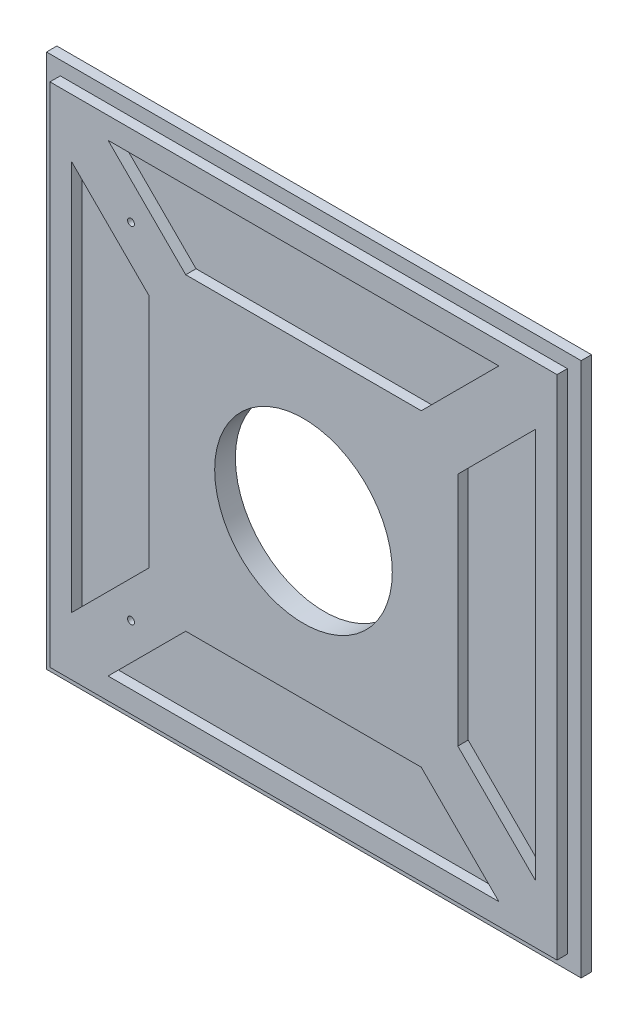
ISO-10303-21;
HEADER;
FILE_DESCRIPTION(('STEP AP214'),'2;1');
FILE_NAME('part.step','',(''),(''),'','','');
FILE_SCHEMA(('AUTOMOTIVE_DESIGN { 1 0 10303 214 1 1 1 1 }'));
ENDSEC;
DATA;
#1=APPLICATION_CONTEXT('core data for automotive mechanical design processes');
#2=APPLICATION_PROTOCOL_DEFINITION('international standard','automotive_design',2000,#1);
#3=PRODUCT_CONTEXT('',#1,'mechanical');
#4=PRODUCT('Part','Part','',(#3));
#5=PRODUCT_RELATED_PRODUCT_CATEGORY('part','',(#4));
#6=PRODUCT_DEFINITION_FORMATION('','',#4);
#7=PRODUCT_DEFINITION_CONTEXT('part definition',#1,'design');
#8=PRODUCT_DEFINITION('design','',#6,#7);
#9=PRODUCT_DEFINITION_SHAPE('','',#8);
#10=(LENGTH_UNIT() NAMED_UNIT(*) SI_UNIT(.MILLI.,.METRE.));
#11=(NAMED_UNIT(*) PLANE_ANGLE_UNIT() SI_UNIT($,.RADIAN.));
#12=(NAMED_UNIT(*) SI_UNIT($,.STERADIAN.) SOLID_ANGLE_UNIT());
#13=UNCERTAINTY_MEASURE_WITH_UNIT(LENGTH_MEASURE(1.E-05),#10,'distance_accuracy_value','');
#14=(GEOMETRIC_REPRESENTATION_CONTEXT(3) GLOBAL_UNCERTAINTY_ASSIGNED_CONTEXT((#13)) GLOBAL_UNIT_ASSIGNED_CONTEXT((#10,
#11,#12)) REPRESENTATION_CONTEXT('',''));
#15=CARTESIAN_POINT('',(0.,0.,0.));
#16=DIRECTION('',(0.,0.,1.));
#17=DIRECTION('',(1.,0.,0.));
#18=AXIS2_PLACEMENT_3D('',#15,#16,#17);
#19=CARTESIAN_POINT('',(0.,0.,0.));
#20=DIRECTION('',(0.,0.,1.));
#21=DIRECTION('',(1.,0.,0.));
#22=AXIS2_PLACEMENT_3D('',#19,#20,#21);
#23=PLANE('',#22);
#24=DIRECTION('',(0.,1.,0.));
#25=VECTOR('',#24,1.);
#26=CARTESIAN_POINT('',(260.,-99.,0.));
#27=LINE('',#26,#25);
#28=CARTESIAN_POINT('',(260.,-109.,0.));
#29=VERTEX_POINT('',#28);
#30=CARTESIAN_POINT('',(260.,-99.,0.));
#31=VERTEX_POINT('',#30);
#32=EDGE_CURVE('E315',#29,#31,#27,.T.);
#33=ORIENTED_EDGE('',*,*,#32,.F.);
#34=DIRECTION('',(-1.,0.,0.));
#35=VECTOR('',#34,1.);
#36=CARTESIAN_POINT('',(260.,-109.,0.));
#37=LINE('',#36,#35);
#38=CARTESIAN_POINT('',(285.,-109.,0.));
#39=VERTEX_POINT('',#38);
#40=EDGE_CURVE('E324',#39,#29,#37,.T.);
#41=ORIENTED_EDGE('',*,*,#40,.F.);
#42=DIRECTION('',(0.,-1.,0.));
#43=VECTOR('',#42,1.);
#44=CARTESIAN_POINT('',(285.,-99.,0.));
#45=LINE('',#44,#43);
#46=CARTESIAN_POINT('',(285.,-99.,0.));
#47=VERTEX_POINT('',#46);
#48=EDGE_CURVE('E332',#47,#39,#45,.T.);
#49=ORIENTED_EDGE('',*,*,#48,.F.);
#50=DIRECTION('',(1.,0.,0.));
#51=VECTOR('',#50,1.);
#52=CARTESIAN_POINT('',(260.,-99.,0.));
#53=LINE('',#52,#51);
#54=EDGE_CURVE('E328',#31,#47,#53,.T.);
#55=ORIENTED_EDGE('',*,*,#54,.F.);
#56=EDGE_LOOP('',(#33,#41,#49,#55));
#57=FACE_BOUND('',#56,.T.);
#58=CARTESIAN_POINT('',(55.,-55.,0.));
#59=DIRECTION('',(0.,0.,-1.));
#60=DIRECTION('',(-1.,0.,0.));
#61=AXIS2_PLACEMENT_3D('',#58,#59,#60);
#62=CIRCLE('',#61,2.);
#63=CARTESIAN_POINT('',(53.,-55.,0.));
#64=VERTEX_POINT('',#63);
#65=EDGE_CURVE('E358',#64,#64,#62,.T.);
#66=ORIENTED_EDGE('',*,*,#65,.F.);
#67=EDGE_LOOP('',(#66));
#68=FACE_BOUND('',#67,.T.);
#69=CARTESIAN_POINT('',(55.,-255.,0.));
#70=DIRECTION('',(0.,0.,-1.));
#71=DIRECTION('',(-1.,0.,0.));
#72=AXIS2_PLACEMENT_3D('',#69,#70,#71);
#73=CIRCLE('',#72,2.);
#74=CARTESIAN_POINT('',(53.,-255.,0.));
#75=VERTEX_POINT('',#74);
#76=EDGE_CURVE('E362',#75,#75,#73,.T.);
#77=ORIENTED_EDGE('',*,*,#76,.F.);
#78=EDGE_LOOP('',(#77));
#79=FACE_BOUND('',#78,.T.);
#80=CARTESIAN_POINT('',(155.,-155.,0.));
#81=DIRECTION('',(0.,0.,1.));
#82=DIRECTION('',(1.,0.,0.));
#83=AXIS2_PLACEMENT_3D('',#80,#81,#82);
#84=CIRCLE('',#83,51.5);
#85=CARTESIAN_POINT('',(206.5,-155.,0.));
#86=VERTEX_POINT('',#85);
#87=EDGE_CURVE('E369',#86,#86,#84,.T.);
#88=ORIENTED_EDGE('',*,*,#87,.T.);
#89=EDGE_LOOP('',(#88));
#90=FACE_BOUND('',#89,.T.);
#91=DIRECTION('',(0.,-1.,0.));
#92=VECTOR('',#91,1.);
#93=CARTESIAN_POINT('',(0.,0.,0.));
#94=LINE('',#93,#92);
#95=CARTESIAN_POINT('',(0.,0.,0.));
#96=VERTEX_POINT('',#95);
#97=CARTESIAN_POINT('',(0.,-310.,0.));
#98=VERTEX_POINT('',#97);
#99=EDGE_CURVE('E597',#96,#98,#94,.T.);
#100=ORIENTED_EDGE('',*,*,#99,.F.);
#101=DIRECTION('',(-1.,0.,0.));
#102=VECTOR('',#101,1.);
#103=CARTESIAN_POINT('',(0.,0.,0.));
#104=LINE('',#103,#102);
#105=CARTESIAN_POINT('',(310.,0.,0.));
#106=VERTEX_POINT('',#105);
#107=EDGE_CURVE('E603',#106,#96,#104,.T.);
#108=ORIENTED_EDGE('',*,*,#107,.F.);
#109=DIRECTION('',(0.,1.,0.));
#110=VECTOR('',#109,1.);
#111=CARTESIAN_POINT('',(310.,0.,0.));
#112=LINE('',#111,#110);
#113=CARTESIAN_POINT('',(310.,-310.,0.));
#114=VERTEX_POINT('',#113);
#115=EDGE_CURVE('E619',#114,#106,#112,.T.);
#116=ORIENTED_EDGE('',*,*,#115,.F.);
#117=DIRECTION('',(1.,0.,0.));
#118=VECTOR('',#117,1.);
#119=CARTESIAN_POINT('',(0.,-310.,0.));
#120=LINE('',#119,#118);
#121=EDGE_CURVE('E616',#98,#114,#120,.T.);
#122=ORIENTED_EDGE('',*,*,#121,.F.);
#123=EDGE_LOOP('',(#100,#108,#116,#122));
#124=FACE_BOUND('',#123,.T.);
#125=DIRECTION('',(0.,1.,0.));
#126=VECTOR('',#125,1.);
#127=CARTESIAN_POINT('',(260.,-211.,0.));
#128=LINE('',#127,#126);
#129=CARTESIAN_POINT('',(260.,-211.,0.));
#130=VERTEX_POINT('',#129);
#131=CARTESIAN_POINT('',(260.,-201.,0.));
#132=VERTEX_POINT('',#131);
#133=EDGE_CURVE('E311',#130,#132,#128,.T.);
#134=ORIENTED_EDGE('',*,*,#133,.F.);
#135=DIRECTION('',(-1.,0.,0.));
#136=VECTOR('',#135,1.);
#137=CARTESIAN_POINT('',(260.,-211.,0.));
#138=LINE('',#137,#136);
#139=CARTESIAN_POINT('',(285.,-211.,0.));
#140=VERTEX_POINT('',#139);
#141=EDGE_CURVE('E304',#140,#130,#138,.T.);
#142=ORIENTED_EDGE('',*,*,#141,.F.);
#143=DIRECTION('',(0.,-1.,0.));
#144=VECTOR('',#143,1.);
#145=CARTESIAN_POINT('',(285.,-211.,0.));
#146=LINE('',#145,#144);
#147=CARTESIAN_POINT('',(285.,-201.,0.));
#148=VERTEX_POINT('',#147);
#149=EDGE_CURVE('E66',#148,#140,#146,.T.);
#150=ORIENTED_EDGE('',*,*,#149,.F.);
#151=DIRECTION('',(1.,0.,0.));
#152=VECTOR('',#151,1.);
#153=CARTESIAN_POINT('',(260.,-201.,0.));
#154=LINE('',#153,#152);
#155=EDGE_CURVE('E61',#132,#148,#154,.T.);
#156=ORIENTED_EDGE('',*,*,#155,.F.);
#157=EDGE_LOOP('',(#134,#142,#150,#156));
#158=FACE_BOUND('',#157,.T.);
#159=ADVANCED_FACE('F45',(#57,#68,#79,#90,#124,#158),#23,.F.);
#160=CARTESIAN_POINT('',(0.,0.,6.));
#161=DIRECTION('',(1.,0.,0.));
#162=DIRECTION('',(0.,1.,0.));
#163=AXIS2_PLACEMENT_3D('',#160,#161,#162);
#164=PLANE('',#163);
#165=ORIENTED_EDGE('',*,*,#99,.T.);
#166=DIRECTION('',(0.,0.,-1.));
#167=VECTOR('',#166,1.);
#168=CARTESIAN_POINT('',(0.,-310.,6.));
#169=LINE('',#168,#167);
#170=CARTESIAN_POINT('',(0.,-310.,6.));
#171=VERTEX_POINT('',#170);
#172=EDGE_CURVE('E11',#171,#98,#169,.T.);
#173=ORIENTED_EDGE('',*,*,#172,.F.);
#174=DIRECTION('',(0.,-1.,0.));
#175=VECTOR('',#174,1.);
#176=CARTESIAN_POINT('',(0.,0.,6.));
#177=LINE('',#176,#175);
#178=CARTESIAN_POINT('',(0.,0.,6.));
#179=VERTEX_POINT('',#178);
#180=EDGE_CURVE('E598',#179,#171,#177,.T.);
#181=ORIENTED_EDGE('',*,*,#180,.F.);
#182=DIRECTION('',(0.,0.,-1.));
#183=VECTOR('',#182,1.);
#184=CARTESIAN_POINT('',(0.,0.,6.));
#185=LINE('',#184,#183);
#186=EDGE_CURVE('E612',#179,#96,#185,.T.);
#187=ORIENTED_EDGE('',*,*,#186,.T.);
#188=EDGE_LOOP('',(#165,#173,#181,#187));
#189=FACE_BOUND('',#188,.T.);
#190=ADVANCED_FACE('F47',(#189),#164,.F.);
#191=CARTESIAN_POINT('',(0.,-310.,6.));
#192=DIRECTION('',(0.,1.,0.));
#193=DIRECTION('',(0.,0.,1.));
#194=AXIS2_PLACEMENT_3D('',#191,#192,#193);
#195=PLANE('',#194);
#196=ORIENTED_EDGE('',*,*,#121,.T.);
#197=DIRECTION('',(0.,0.,-1.));
#198=VECTOR('',#197,1.);
#199=CARTESIAN_POINT('',(310.,-310.,6.));
#200=LINE('',#199,#198);
#201=CARTESIAN_POINT('',(310.,-310.,6.));
#202=VERTEX_POINT('',#201);
#203=EDGE_CURVE('E54',#202,#114,#200,.T.);
#204=ORIENTED_EDGE('',*,*,#203,.F.);
#205=DIRECTION('',(1.,0.,0.));
#206=VECTOR('',#205,1.);
#207=CARTESIAN_POINT('',(0.,-310.,6.));
#208=LINE('',#207,#206);
#209=EDGE_CURVE('E602',#171,#202,#208,.T.);
#210=ORIENTED_EDGE('',*,*,#209,.F.);
#211=ORIENTED_EDGE('',*,*,#172,.T.);
#212=EDGE_LOOP('',(#196,#204,#210,#211));
#213=FACE_BOUND('',#212,.T.);
#214=ADVANCED_FACE('F651',(#213),#195,.F.);
#215=CARTESIAN_POINT('',(310.,0.,6.));
#216=DIRECTION('',(-1.,0.,0.));
#217=DIRECTION('',(0.,-1.,0.));
#218=AXIS2_PLACEMENT_3D('',#215,#216,#217);
#219=PLANE('',#218);
#220=ORIENTED_EDGE('',*,*,#115,.T.);
#221=DIRECTION('',(0.,0.,-1.));
#222=VECTOR('',#221,1.);
#223=CARTESIAN_POINT('',(310.,0.,6.));
#224=LINE('',#223,#222);
#225=CARTESIAN_POINT('',(310.,0.,6.));
#226=VERTEX_POINT('',#225);
#227=EDGE_CURVE('E627',#226,#106,#224,.T.);
#228=ORIENTED_EDGE('',*,*,#227,.F.);
#229=DIRECTION('',(0.,1.,0.));
#230=VECTOR('',#229,1.);
#231=CARTESIAN_POINT('',(310.,0.,6.));
#232=LINE('',#231,#230);
#233=EDGE_CURVE('E606',#202,#226,#232,.T.);
#234=ORIENTED_EDGE('',*,*,#233,.F.);
#235=ORIENTED_EDGE('',*,*,#203,.T.);
#236=EDGE_LOOP('',(#220,#228,#234,#235));
#237=FACE_BOUND('',#236,.T.);
#238=ADVANCED_FACE('F636',(#237),#219,.F.);
#239=CARTESIAN_POINT('',(0.,0.,6.));
#240=DIRECTION('',(0.,-1.,0.));
#241=DIRECTION('',(0.,0.,-1.));
#242=AXIS2_PLACEMENT_3D('',#239,#240,#241);
#243=PLANE('',#242);
#244=ORIENTED_EDGE('',*,*,#107,.T.);
#245=ORIENTED_EDGE('',*,*,#186,.F.);
#246=DIRECTION('',(-1.,0.,0.));
#247=VECTOR('',#246,1.);
#248=CARTESIAN_POINT('',(0.,0.,6.));
#249=LINE('',#248,#247);
#250=EDGE_CURVE('E609',#226,#179,#249,.T.);
#251=ORIENTED_EDGE('',*,*,#250,.F.);
#252=ORIENTED_EDGE('',*,*,#227,.T.);
#253=EDGE_LOOP('',(#244,#245,#251,#252));
#254=FACE_BOUND('',#253,.T.);
#255=ADVANCED_FACE('F644',(#254),#243,.F.);
#256=CARTESIAN_POINT('',(0.,0.,6.));
#257=DIRECTION('',(0.,0.,1.));
#258=DIRECTION('',(1.,0.,0.));
#259=AXIS2_PLACEMENT_3D('',#256,#257,#258);
#260=PLANE('',#259);
#261=DIRECTION('',(0.,-1.,0.));
#262=VECTOR('',#261,1.);
#263=CARTESIAN_POINT('',(8.,-302.,6.));
#264=LINE('',#263,#262);
#265=CARTESIAN_POINT('',(8.,-8.,6.));
#266=VERTEX_POINT('',#265);
#267=CARTESIAN_POINT('',(8.,-302.,6.));
#268=VERTEX_POINT('',#267);
#269=EDGE_CURVE('E552',#266,#268,#264,.T.);
#270=ORIENTED_EDGE('',*,*,#269,.F.);
#271=DIRECTION('',(-1.,0.,0.));
#272=VECTOR('',#271,1.);
#273=CARTESIAN_POINT('',(33.,-8.,6.));
#274=LINE('',#273,#272);
#275=CARTESIAN_POINT('',(302.,-8.,6.));
#276=VERTEX_POINT('',#275);
#277=EDGE_CURVE('E558',#276,#266,#274,.T.);
#278=ORIENTED_EDGE('',*,*,#277,.F.);
#279=DIRECTION('',(0.,1.,0.));
#280=VECTOR('',#279,1.);
#281=CARTESIAN_POINT('',(302.,-8.,6.));
#282=LINE('',#281,#280);
#283=CARTESIAN_POINT('',(302.,-302.,6.));
#284=VERTEX_POINT('',#283);
#285=EDGE_CURVE('E575',#284,#276,#282,.T.);
#286=ORIENTED_EDGE('',*,*,#285,.F.);
#287=DIRECTION('',(1.,0.,0.));
#288=VECTOR('',#287,1.);
#289=CARTESIAN_POINT('',(302.,-302.,6.));
#290=LINE('',#289,#288);
#291=EDGE_CURVE('E571',#268,#284,#290,.T.);
#292=ORIENTED_EDGE('',*,*,#291,.F.);
#293=EDGE_LOOP('',(#270,#278,#286,#292));
#294=FACE_BOUND('',#293,.T.);
#295=ORIENTED_EDGE('',*,*,#180,.T.);
#296=ORIENTED_EDGE('',*,*,#209,.T.);
#297=ORIENTED_EDGE('',*,*,#233,.T.);
#298=ORIENTED_EDGE('',*,*,#250,.T.);
#299=EDGE_LOOP('',(#295,#296,#297,#298));
#300=FACE_BOUND('',#299,.T.);
#301=ADVANCED_FACE('F650',(#294,#300),#260,.T.);
#302=CARTESIAN_POINT('',(0.,0.,12.));
#303=DIRECTION('',(0.,0.,-1.));
#304=DIRECTION('',(-1.,0.,0.));
#305=AXIS2_PLACEMENT_3D('',#302,#303,#304);
#306=PLANE('',#305);
#307=CARTESIAN_POINT('',(55.,-55.,12.));
#308=DIRECTION('',(0.,0.,-1.));
#309=DIRECTION('',(-1.,0.,0.));
#310=AXIS2_PLACEMENT_3D('',#307,#308,#309);
#311=CIRCLE('',#310,2.);
#312=CARTESIAN_POINT('',(53.,-55.,12.));
#313=VERTEX_POINT('',#312);
#314=EDGE_CURVE('E353',#313,#313,#311,.T.);
#315=ORIENTED_EDGE('',*,*,#314,.T.);
#316=EDGE_LOOP('',(#315));
#317=FACE_BOUND('',#316,.T.);
#318=CARTESIAN_POINT('',(55.,-255.,12.));
#319=DIRECTION('',(0.,0.,-1.));
#320=DIRECTION('',(-1.,0.,0.));
#321=AXIS2_PLACEMENT_3D('',#318,#319,#320);
#322=CIRCLE('',#321,2.);
#323=CARTESIAN_POINT('',(53.,-255.,12.));
#324=VERTEX_POINT('',#323);
#325=EDGE_CURVE('E352',#324,#324,#322,.T.);
#326=ORIENTED_EDGE('',*,*,#325,.T.);
#327=EDGE_LOOP('',(#326));
#328=FACE_BOUND('',#327,.T.);
#329=CARTESIAN_POINT('',(155.,-155.,12.));
#330=DIRECTION('',(0.,0.,1.));
#331=DIRECTION('',(1.,0.,0.));
#332=AXIS2_PLACEMENT_3D('',#329,#330,#331);
#333=CIRCLE('',#332,51.5);
#334=CARTESIAN_POINT('',(206.5,-155.,12.));
#335=VERTEX_POINT('',#334);
#336=EDGE_CURVE('E357',#335,#335,#333,.T.);
#337=ORIENTED_EDGE('',*,*,#336,.F.);
#338=EDGE_LOOP('',(#337));
#339=FACE_BOUND('',#338,.T.);
#340=DIRECTION('',(0.,1.,0.));
#341=VECTOR('',#340,1.);
#342=CARTESIAN_POINT('',(289.5,-41.7132034355964,12.));
#343=LINE('',#342,#341);
#344=CARTESIAN_POINT('',(289.5,-268.286796564404,12.));
#345=VERTEX_POINT('',#344);
#346=CARTESIAN_POINT('',(289.5,-41.7132034355964,12.));
#347=VERTEX_POINT('',#346);
#348=EDGE_CURVE('E421',#345,#347,#343,.T.);
#349=ORIENTED_EDGE('',*,*,#348,.F.);
#350=DIRECTION('',(0.707106781186547,-0.707106781186547,0.));
#351=VECTOR('',#350,1.);
#352=CARTESIAN_POINT('',(244.5,-223.286796564404,12.));
#353=LINE('',#352,#351);
#354=CARTESIAN_POINT('',(244.5,-223.286796564404,12.));
#355=VERTEX_POINT('',#354);
#356=EDGE_CURVE('E432',#355,#345,#353,.T.);
#357=ORIENTED_EDGE('',*,*,#356,.F.);
#358=DIRECTION('',(0.,-1.,0.));
#359=VECTOR('',#358,1.);
#360=CARTESIAN_POINT('',(244.5,-86.7132034355965,12.));
#361=LINE('',#360,#359);
#362=CARTESIAN_POINT('',(244.5,-86.7132034355965,12.));
#363=VERTEX_POINT('',#362);
#364=EDGE_CURVE('E428',#363,#355,#361,.T.);
#365=ORIENTED_EDGE('',*,*,#364,.F.);
#366=DIRECTION('',(-0.707106781186547,-0.707106781186548,0.));
#367=VECTOR('',#366,1.);
#368=CARTESIAN_POINT('',(289.5,-41.7132034355964,12.));
#369=LINE('',#368,#367);
#370=EDGE_CURVE('E424',#347,#363,#369,.T.);
#371=ORIENTED_EDGE('',*,*,#370,.F.);
#372=EDGE_LOOP('',(#349,#357,#365,#371));
#373=FACE_BOUND('',#372,.T.);
#374=DIRECTION('',(-1.,0.,0.));
#375=VECTOR('',#374,1.);
#376=CARTESIAN_POINT('',(268.286796564404,-20.5,12.));
#377=LINE('',#376,#375);
#378=CARTESIAN_POINT('',(268.286796564404,-20.5,12.));
#379=VERTEX_POINT('',#378);
#380=CARTESIAN_POINT('',(41.7132034355965,-20.5,12.));
#381=VERTEX_POINT('',#380);
#382=EDGE_CURVE('E509',#379,#381,#377,.T.);
#383=ORIENTED_EDGE('',*,*,#382,.F.);
#384=DIRECTION('',(0.707106781186547,0.707106781186548,0.));
#385=VECTOR('',#384,1.);
#386=CARTESIAN_POINT('',(268.286796564404,-20.5,12.));
#387=LINE('',#386,#385);
#388=CARTESIAN_POINT('',(223.286796564404,-65.5,12.));
#389=VERTEX_POINT('',#388);
#390=EDGE_CURVE('E520',#389,#379,#387,.T.);
#391=ORIENTED_EDGE('',*,*,#390,.F.);
#392=DIRECTION('',(1.,0.,0.));
#393=VECTOR('',#392,1.);
#394=CARTESIAN_POINT('',(86.7132034355965,-65.5,12.));
#395=LINE('',#394,#393);
#396=CARTESIAN_POINT('',(86.7132034355965,-65.5,12.));
#397=VERTEX_POINT('',#396);
#398=EDGE_CURVE('E516',#397,#389,#395,.T.);
#399=ORIENTED_EDGE('',*,*,#398,.F.);
#400=DIRECTION('',(0.707106781186548,-0.707106781186547,0.));
#401=VECTOR('',#400,1.);
#402=CARTESIAN_POINT('',(86.7132034355965,-65.5,12.));
#403=LINE('',#402,#401);
#404=EDGE_CURVE('E512',#381,#397,#403,.T.);
#405=ORIENTED_EDGE('',*,*,#404,.F.);
#406=EDGE_LOOP('',(#383,#391,#399,#405));
#407=FACE_BOUND('',#406,.T.);
#408=DIRECTION('',(-1.,0.,0.));
#409=VECTOR('',#408,1.);
#410=CARTESIAN_POINT('',(8.,-8.,12.));
#411=LINE('',#410,#409);
#412=CARTESIAN_POINT('',(302.,-8.,12.));
#413=VERTEX_POINT('',#412);
#414=CARTESIAN_POINT('',(8.,-8.,12.));
#415=VERTEX_POINT('',#414);
#416=EDGE_CURVE('E553',#413,#415,#411,.T.);
#417=ORIENTED_EDGE('',*,*,#416,.T.);
#418=DIRECTION('',(0.,-1.,0.));
#419=VECTOR('',#418,1.);
#420=CARTESIAN_POINT('',(8.,-8.,12.));
#421=LINE('',#420,#419);
#422=CARTESIAN_POINT('',(8.,-302.,12.));
#423=VERTEX_POINT('',#422);
#424=EDGE_CURVE('E557',#415,#423,#421,.T.);
#425=ORIENTED_EDGE('',*,*,#424,.T.);
#426=DIRECTION('',(1.,0.,0.));
#427=VECTOR('',#426,1.);
#428=CARTESIAN_POINT('',(8.,-302.,12.));
#429=LINE('',#428,#427);
#430=CARTESIAN_POINT('',(302.,-302.,12.));
#431=VERTEX_POINT('',#430);
#432=EDGE_CURVE('E561',#423,#431,#429,.T.);
#433=ORIENTED_EDGE('',*,*,#432,.T.);
#434=DIRECTION('',(0.,1.,0.));
#435=VECTOR('',#434,1.);
#436=CARTESIAN_POINT('',(302.,-302.,12.));
#437=LINE('',#436,#435);
#438=EDGE_CURVE('E564',#431,#413,#437,.T.);
#439=ORIENTED_EDGE('',*,*,#438,.T.);
#440=EDGE_LOOP('',(#417,#425,#433,#439));
#441=FACE_BOUND('',#440,.T.);
#442=DIRECTION('',(0.,-1.,0.));
#443=VECTOR('',#442,1.);
#444=CARTESIAN_POINT('',(20.5,-41.7132034355964,12.));
#445=LINE('',#444,#443);
#446=CARTESIAN_POINT('',(20.5,-41.7132034355964,12.));
#447=VERTEX_POINT('',#446);
#448=CARTESIAN_POINT('',(20.5,-268.286796564404,12.));
#449=VERTEX_POINT('',#448);
#450=EDGE_CURVE('E465',#447,#449,#445,.T.);
#451=ORIENTED_EDGE('',*,*,#450,.F.);
#452=DIRECTION('',(-0.707106781186548,0.707106781186548,0.));
#453=VECTOR('',#452,1.);
#454=CARTESIAN_POINT('',(20.5,-41.7132034355964,12.));
#455=LINE('',#454,#453);
#456=CARTESIAN_POINT('',(65.5,-86.7132034355964,12.));
#457=VERTEX_POINT('',#456);
#458=EDGE_CURVE('E476',#457,#447,#455,.T.);
#459=ORIENTED_EDGE('',*,*,#458,.F.);
#460=DIRECTION('',(0.,1.,0.));
#461=VECTOR('',#460,1.);
#462=CARTESIAN_POINT('',(65.5,-86.7132034355964,12.));
#463=LINE('',#462,#461);
#464=CARTESIAN_POINT('',(65.5,-223.286796564404,12.));
#465=VERTEX_POINT('',#464);
#466=EDGE_CURVE('E472',#465,#457,#463,.T.);
#467=ORIENTED_EDGE('',*,*,#466,.F.);
#468=DIRECTION('',(0.707106781186547,0.707106781186547,0.));
#469=VECTOR('',#468,1.);
#470=CARTESIAN_POINT('',(65.5,-223.286796564404,12.));
#471=LINE('',#470,#469);
#472=EDGE_CURVE('E468',#449,#465,#471,.T.);
#473=ORIENTED_EDGE('',*,*,#472,.F.);
#474=EDGE_LOOP('',(#451,#459,#467,#473));
#475=FACE_BOUND('',#474,.T.);
#476=DIRECTION('',(-0.707106781186548,0.707106781186547,0.));
#477=VECTOR('',#476,1.);
#478=CARTESIAN_POINT('',(223.286796564404,-244.5,12.));
#479=LINE('',#478,#477);
#480=CARTESIAN_POINT('',(268.286796564404,-289.5,12.));
#481=VERTEX_POINT('',#480);
#482=CARTESIAN_POINT('',(223.286796564404,-244.5,12.));
#483=VERTEX_POINT('',#482);
#484=EDGE_CURVE('E377',#481,#483,#479,.T.);
#485=ORIENTED_EDGE('',*,*,#484,.F.);
#486=DIRECTION('',(1.,0.,0.));
#487=VECTOR('',#486,1.);
#488=CARTESIAN_POINT('',(268.286796564404,-289.5,12.));
#489=LINE('',#488,#487);
#490=CARTESIAN_POINT('',(41.7132034355964,-289.5,12.));
#491=VERTEX_POINT('',#490);
#492=EDGE_CURVE('E388',#491,#481,#489,.T.);
#493=ORIENTED_EDGE('',*,*,#492,.F.);
#494=DIRECTION('',(-0.707106781186548,-0.707106781186547,0.));
#495=VECTOR('',#494,1.);
#496=CARTESIAN_POINT('',(41.7132034355964,-289.5,12.));
#497=LINE('',#496,#495);
#498=CARTESIAN_POINT('',(86.7132034355964,-244.5,12.));
#499=VERTEX_POINT('',#498);
#500=EDGE_CURVE('E384',#499,#491,#497,.T.);
#501=ORIENTED_EDGE('',*,*,#500,.F.);
#502=DIRECTION('',(-1.,0.,0.));
#503=VECTOR('',#502,1.);
#504=CARTESIAN_POINT('',(86.7132034355964,-244.5,12.));
#505=LINE('',#504,#503);
#506=EDGE_CURVE('E380',#483,#499,#505,.T.);
#507=ORIENTED_EDGE('',*,*,#506,.F.);
#508=EDGE_LOOP('',(#485,#493,#501,#507));
#509=FACE_BOUND('',#508,.T.);
#510=ADVANCED_FACE('F673',(#317,#328,#339,#373,#407,#441,#475,#509),#306,.F.);
#511=CARTESIAN_POINT('',(8.,-302.,12.));
#512=DIRECTION('',(1.,0.,0.));
#513=DIRECTION('',(0.,1.,0.));
#514=AXIS2_PLACEMENT_3D('',#511,#512,#513);
#515=PLANE('',#514);
#516=ORIENTED_EDGE('',*,*,#269,.T.);
#517=DIRECTION('',(0.,0.,-1.));
#518=VECTOR('',#517,1.);
#519=CARTESIAN_POINT('',(8.,-302.,12.));
#520=LINE('',#519,#518);
#521=EDGE_CURVE('E589',#423,#268,#520,.T.);
#522=ORIENTED_EDGE('',*,*,#521,.F.);
#523=ORIENTED_EDGE('',*,*,#424,.F.);
#524=DIRECTION('',(0.,0.,-1.));
#525=VECTOR('',#524,1.);
#526=CARTESIAN_POINT('',(8.,-8.,12.));
#527=LINE('',#526,#525);
#528=EDGE_CURVE('E593',#415,#266,#527,.T.);
#529=ORIENTED_EDGE('',*,*,#528,.T.);
#530=EDGE_LOOP('',(#516,#522,#523,#529));
#531=FACE_BOUND('',#530,.T.);
#532=ADVANCED_FACE('F681',(#531),#515,.F.);
#533=CARTESIAN_POINT('',(302.,-302.,12.));
#534=DIRECTION('',(0.,1.,0.));
#535=DIRECTION('',(0.,0.,1.));
#536=AXIS2_PLACEMENT_3D('',#533,#534,#535);
#537=PLANE('',#536);
#538=ORIENTED_EDGE('',*,*,#291,.T.);
#539=DIRECTION('',(0.,0.,-1.));
#540=VECTOR('',#539,1.);
#541=CARTESIAN_POINT('',(302.,-302.,12.));
#542=LINE('',#541,#540);
#543=EDGE_CURVE('E585',#431,#284,#542,.T.);
#544=ORIENTED_EDGE('',*,*,#543,.F.);
#545=ORIENTED_EDGE('',*,*,#432,.F.);
#546=ORIENTED_EDGE('',*,*,#521,.T.);
#547=EDGE_LOOP('',(#538,#544,#545,#546));
#548=FACE_BOUND('',#547,.T.);
#549=ADVANCED_FACE('F775',(#548),#537,.F.);
#550=CARTESIAN_POINT('',(302.,-8.,12.));
#551=DIRECTION('',(-1.,0.,0.));
#552=DIRECTION('',(0.,0.,1.));
#553=AXIS2_PLACEMENT_3D('',#550,#551,#552);
#554=PLANE('',#553);
#555=ORIENTED_EDGE('',*,*,#285,.T.);
#556=DIRECTION('',(0.,0.,-1.));
#557=VECTOR('',#556,1.);
#558=CARTESIAN_POINT('',(302.,-8.,12.));
#559=LINE('',#558,#557);
#560=EDGE_CURVE('E567',#413,#276,#559,.T.);
#561=ORIENTED_EDGE('',*,*,#560,.F.);
#562=ORIENTED_EDGE('',*,*,#438,.F.);
#563=ORIENTED_EDGE('',*,*,#543,.T.);
#564=EDGE_LOOP('',(#555,#561,#562,#563));
#565=FACE_BOUND('',#564,.T.);
#566=ADVANCED_FACE('F771',(#565),#554,.F.);
#567=CARTESIAN_POINT('',(33.,-8.,12.));
#568=DIRECTION('',(0.,-1.,0.));
#569=DIRECTION('',(0.,0.,-1.));
#570=AXIS2_PLACEMENT_3D('',#567,#568,#569);
#571=PLANE('',#570);
#572=ORIENTED_EDGE('',*,*,#277,.T.);
#573=ORIENTED_EDGE('',*,*,#528,.F.);
#574=ORIENTED_EDGE('',*,*,#416,.F.);
#575=ORIENTED_EDGE('',*,*,#560,.T.);
#576=EDGE_LOOP('',(#572,#573,#574,#575));
#577=FACE_BOUND('',#576,.T.);
#578=ADVANCED_FACE('F766',(#577),#571,.F.);
#579=CARTESIAN_POINT('',(268.286796564404,-20.5,12.));
#580=DIRECTION('',(0.,-1.,0.));
#581=DIRECTION('',(1.,0.,0.));
#582=AXIS2_PLACEMENT_3D('',#579,#580,#581);
#583=PLANE('',#582);
#584=DIRECTION('',(-1.,0.,0.));
#585=VECTOR('',#584,1.);
#586=CARTESIAN_POINT('',(268.286796564404,-20.5,6.));
#587=LINE('',#586,#585);
#588=CARTESIAN_POINT('',(268.286796564404,-20.5,6.));
#589=VERTEX_POINT('',#588);
#590=CARTESIAN_POINT('',(41.7132034355965,-20.5,6.));
#591=VERTEX_POINT('',#590);
#592=EDGE_CURVE('E508',#589,#591,#587,.T.);
#593=ORIENTED_EDGE('',*,*,#592,.F.);
#594=DIRECTION('',(0.,0.,-1.));
#595=VECTOR('',#594,1.);
#596=CARTESIAN_POINT('',(268.286796564404,-20.5,12.));
#597=LINE('',#596,#595);
#598=EDGE_CURVE('E523',#379,#589,#597,.T.);
#599=ORIENTED_EDGE('',*,*,#598,.F.);
#600=ORIENTED_EDGE('',*,*,#382,.T.);
#601=DIRECTION('',(0.,0.,-1.));
#602=VECTOR('',#601,1.);
#603=CARTESIAN_POINT('',(41.7132034355965,-20.5,12.));
#604=LINE('',#603,#602);
#605=EDGE_CURVE('E548',#381,#591,#604,.T.);
#606=ORIENTED_EDGE('',*,*,#605,.T.);
#607=EDGE_LOOP('',(#593,#599,#600,#606));
#608=FACE_BOUND('',#607,.T.);
#609=ADVANCED_FACE('F763',(#608),#583,.T.);
#610=CARTESIAN_POINT('',(86.7132034355965,-65.5,12.));
#611=DIRECTION('',(0.707106781186547,0.707106781186548,0.));
#612=DIRECTION('',(-0.707106781186548,0.707106781186547,0.));
#613=AXIS2_PLACEMENT_3D('',#610,#611,#612);
#614=PLANE('',#613);
#615=DIRECTION('',(0.707106781186548,-0.707106781186547,0.));
#616=VECTOR('',#615,1.);
#617=CARTESIAN_POINT('',(86.7132034355965,-65.5,6.));
#618=LINE('',#617,#616);
#619=CARTESIAN_POINT('',(86.7132034355965,-65.5,6.));
#620=VERTEX_POINT('',#619);
#621=EDGE_CURVE('E527',#591,#620,#618,.T.);
#622=ORIENTED_EDGE('',*,*,#621,.F.);
#623=ORIENTED_EDGE('',*,*,#605,.F.);
#624=ORIENTED_EDGE('',*,*,#404,.T.);
#625=DIRECTION('',(0.,0.,-1.));
#626=VECTOR('',#625,1.);
#627=CARTESIAN_POINT('',(86.7132034355965,-65.5,12.));
#628=LINE('',#627,#626);
#629=EDGE_CURVE('E545',#397,#620,#628,.T.);
#630=ORIENTED_EDGE('',*,*,#629,.T.);
#631=EDGE_LOOP('',(#622,#623,#624,#630));
#632=FACE_BOUND('',#631,.T.);
#633=ADVANCED_FACE('F759',(#632),#614,.T.);
#634=CARTESIAN_POINT('',(86.7132034355965,-65.5,12.));
#635=DIRECTION('',(0.,1.,0.));
#636=DIRECTION('',(-1.,0.,0.));
#637=AXIS2_PLACEMENT_3D('',#634,#635,#636);
#638=PLANE('',#637);
#639=DIRECTION('',(1.,0.,0.));
#640=VECTOR('',#639,1.);
#641=CARTESIAN_POINT('',(86.7132034355965,-65.5,6.));
#642=LINE('',#641,#640);
#643=CARTESIAN_POINT('',(223.286796564404,-65.5,6.));
#644=VERTEX_POINT('',#643);
#645=EDGE_CURVE('E531',#620,#644,#642,.T.);
#646=ORIENTED_EDGE('',*,*,#645,.F.);
#647=ORIENTED_EDGE('',*,*,#629,.F.);
#648=ORIENTED_EDGE('',*,*,#398,.T.);
#649=DIRECTION('',(0.,0.,-1.));
#650=VECTOR('',#649,1.);
#651=CARTESIAN_POINT('',(223.286796564404,-65.5,12.));
#652=LINE('',#651,#650);
#653=EDGE_CURVE('E541',#389,#644,#652,.T.);
#654=ORIENTED_EDGE('',*,*,#653,.T.);
#655=EDGE_LOOP('',(#646,#647,#648,#654));
#656=FACE_BOUND('',#655,.T.);
#657=ADVANCED_FACE('F755',(#656),#638,.T.);
#658=CARTESIAN_POINT('',(268.286796564404,-20.5,12.));
#659=DIRECTION('',(-0.707106781186548,0.707106781186547,0.));
#660=DIRECTION('',(-0.707106781186547,-0.707106781186548,0.));
#661=AXIS2_PLACEMENT_3D('',#658,#659,#660);
#662=PLANE('',#661);
#663=DIRECTION('',(0.707106781186547,0.707106781186548,0.));
#664=VECTOR('',#663,1.);
#665=CARTESIAN_POINT('',(268.286796564404,-20.5,6.));
#666=LINE('',#665,#664);
#667=EDGE_CURVE('E513',#644,#589,#666,.T.);
#668=ORIENTED_EDGE('',*,*,#667,.F.);
#669=ORIENTED_EDGE('',*,*,#653,.F.);
#670=ORIENTED_EDGE('',*,*,#390,.T.);
#671=ORIENTED_EDGE('',*,*,#598,.T.);
#672=EDGE_LOOP('',(#668,#669,#670,#671));
#673=FACE_BOUND('',#672,.T.);
#674=ADVANCED_FACE('F751',(#673),#662,.T.);
#675=CARTESIAN_POINT('',(20.5,-41.7132034355964,12.));
#676=DIRECTION('',(1.,0.,0.));
#677=DIRECTION('',(0.,1.,0.));
#678=AXIS2_PLACEMENT_3D('',#675,#676,#677);
#679=PLANE('',#678);
#680=DIRECTION('',(0.,-1.,0.));
#681=VECTOR('',#680,1.);
#682=CARTESIAN_POINT('',(20.5,-41.7132034355964,6.));
#683=LINE('',#682,#681);
#684=CARTESIAN_POINT('',(20.5,-41.7132034355964,6.));
#685=VERTEX_POINT('',#684);
#686=CARTESIAN_POINT('',(20.5,-268.286796564404,6.));
#687=VERTEX_POINT('',#686);
#688=EDGE_CURVE('E464',#685,#687,#683,.T.);
#689=ORIENTED_EDGE('',*,*,#688,.F.);
#690=DIRECTION('',(0.,0.,-1.));
#691=VECTOR('',#690,1.);
#692=CARTESIAN_POINT('',(20.5,-41.7132034355964,12.));
#693=LINE('',#692,#691);
#694=EDGE_CURVE('E479',#447,#685,#693,.T.);
#695=ORIENTED_EDGE('',*,*,#694,.F.);
#696=ORIENTED_EDGE('',*,*,#450,.T.);
#697=DIRECTION('',(0.,0.,-1.));
#698=VECTOR('',#697,1.);
#699=CARTESIAN_POINT('',(20.5,-268.286796564404,12.));
#700=LINE('',#699,#698);
#701=EDGE_CURVE('E504',#449,#687,#700,.T.);
#702=ORIENTED_EDGE('',*,*,#701,.T.);
#703=EDGE_LOOP('',(#689,#695,#696,#702));
#704=FACE_BOUND('',#703,.T.);
#705=ADVANCED_FACE('F747',(#704),#679,.T.);
#706=CARTESIAN_POINT('',(65.5,-223.286796564404,12.));
#707=DIRECTION('',(-0.707106781186548,0.707106781186548,0.));
#708=DIRECTION('',(-0.707106781186548,-0.707106781186548,0.));
#709=AXIS2_PLACEMENT_3D('',#706,#707,#708);
#710=PLANE('',#709);
#711=DIRECTION('',(0.707106781186547,0.707106781186547,0.));
#712=VECTOR('',#711,1.);
#713=CARTESIAN_POINT('',(65.5,-223.286796564404,6.));
#714=LINE('',#713,#712);
#715=CARTESIAN_POINT('',(65.5,-223.286796564404,6.));
#716=VERTEX_POINT('',#715);
#717=EDGE_CURVE('E483',#687,#716,#714,.T.);
#718=ORIENTED_EDGE('',*,*,#717,.F.);
#719=ORIENTED_EDGE('',*,*,#701,.F.);
#720=ORIENTED_EDGE('',*,*,#472,.T.);
#721=DIRECTION('',(0.,0.,-1.));
#722=VECTOR('',#721,1.);
#723=CARTESIAN_POINT('',(65.5,-223.286796564404,12.));
#724=LINE('',#723,#722);
#725=EDGE_CURVE('E501',#465,#716,#724,.T.);
#726=ORIENTED_EDGE('',*,*,#725,.T.);
#727=EDGE_LOOP('',(#718,#719,#720,#726));
#728=FACE_BOUND('',#727,.T.);
#729=ADVANCED_FACE('F743',(#728),#710,.T.);
#730=CARTESIAN_POINT('',(65.5,-86.7132034355964,12.));
#731=DIRECTION('',(-1.,0.,0.));
#732=DIRECTION('',(0.,-1.,0.));
#733=AXIS2_PLACEMENT_3D('',#730,#731,#732);
#734=PLANE('',#733);
#735=DIRECTION('',(0.,1.,0.));
#736=VECTOR('',#735,1.);
#737=CARTESIAN_POINT('',(65.5,-86.7132034355964,6.));
#738=LINE('',#737,#736);
#739=CARTESIAN_POINT('',(65.5,-86.7132034355964,6.));
#740=VERTEX_POINT('',#739);
#741=EDGE_CURVE('E487',#716,#740,#738,.T.);
#742=ORIENTED_EDGE('',*,*,#741,.F.);
#743=ORIENTED_EDGE('',*,*,#725,.F.);
#744=ORIENTED_EDGE('',*,*,#466,.T.);
#745=DIRECTION('',(0.,0.,-1.));
#746=VECTOR('',#745,1.);
#747=CARTESIAN_POINT('',(65.5,-86.7132034355964,12.));
#748=LINE('',#747,#746);
#749=EDGE_CURVE('E497',#457,#740,#748,.T.);
#750=ORIENTED_EDGE('',*,*,#749,.T.);
#751=EDGE_LOOP('',(#742,#743,#744,#750));
#752=FACE_BOUND('',#751,.T.);
#753=ADVANCED_FACE('F739',(#752),#734,.T.);
#754=CARTESIAN_POINT('',(20.5,-41.7132034355964,12.));
#755=DIRECTION('',(-0.707106781186547,-0.707106781186547,0.));
#756=DIRECTION('',(0.707106781186548,-0.707106781186548,0.));
#757=AXIS2_PLACEMENT_3D('',#754,#755,#756);
#758=PLANE('',#757);
#759=DIRECTION('',(-0.707106781186548,0.707106781186548,0.));
#760=VECTOR('',#759,1.);
#761=CARTESIAN_POINT('',(20.5,-41.7132034355964,6.));
#762=LINE('',#761,#760);
#763=EDGE_CURVE('E469',#740,#685,#762,.T.);
#764=ORIENTED_EDGE('',*,*,#763,.F.);
#765=ORIENTED_EDGE('',*,*,#749,.F.);
#766=ORIENTED_EDGE('',*,*,#458,.T.);
#767=ORIENTED_EDGE('',*,*,#694,.T.);
#768=EDGE_LOOP('',(#764,#765,#766,#767));
#769=FACE_BOUND('',#768,.T.);
#770=ADVANCED_FACE('F733',(#769),#758,.T.);
#771=CARTESIAN_POINT('',(289.5,-41.7132034355964,12.));
#772=DIRECTION('',(-1.,0.,0.));
#773=DIRECTION('',(0.,0.,1.));
#774=AXIS2_PLACEMENT_3D('',#771,#772,#773);
#775=PLANE('',#774);
#776=DIRECTION('',(0.,1.,0.));
#777=VECTOR('',#776,1.);
#778=CARTESIAN_POINT('',(289.5,-41.7132034355964,6.));
#779=LINE('',#778,#777);
#780=CARTESIAN_POINT('',(289.5,-268.286796564404,6.));
#781=VERTEX_POINT('',#780);
#782=CARTESIAN_POINT('',(289.5,-41.7132034355964,6.));
#783=VERTEX_POINT('',#782);
#784=EDGE_CURVE('E420',#781,#783,#779,.T.);
#785=ORIENTED_EDGE('',*,*,#784,.F.);
#786=DIRECTION('',(0.,0.,-1.));
#787=VECTOR('',#786,1.);
#788=CARTESIAN_POINT('',(289.5,-268.286796564404,12.));
#789=LINE('',#788,#787);
#790=EDGE_CURVE('E435',#345,#781,#789,.T.);
#791=ORIENTED_EDGE('',*,*,#790,.F.);
#792=ORIENTED_EDGE('',*,*,#348,.T.);
#793=DIRECTION('',(0.,0.,-1.));
#794=VECTOR('',#793,1.);
#795=CARTESIAN_POINT('',(289.5,-41.7132034355964,12.));
#796=LINE('',#795,#794);
#797=EDGE_CURVE('E460',#347,#783,#796,.T.);
#798=ORIENTED_EDGE('',*,*,#797,.T.);
#799=EDGE_LOOP('',(#785,#791,#792,#798));
#800=FACE_BOUND('',#799,.T.);
#801=ADVANCED_FACE('F719',(#800),#775,.T.);
#802=CARTESIAN_POINT('',(289.5,-41.7132034355964,12.));
#803=DIRECTION('',(0.707106781186548,-0.707106781186547,0.));
#804=DIRECTION('',(0.707106781186547,0.707106781186548,0.));
#805=AXIS2_PLACEMENT_3D('',#802,#803,#804);
#806=PLANE('',#805);
#807=DIRECTION('',(-0.707106781186547,-0.707106781186548,0.));
#808=VECTOR('',#807,1.);
#809=CARTESIAN_POINT('',(289.5,-41.7132034355964,6.));
#810=LINE('',#809,#808);
#811=CARTESIAN_POINT('',(244.5,-86.7132034355965,6.));
#812=VERTEX_POINT('',#811);
#813=EDGE_CURVE('E439',#783,#812,#810,.T.);
#814=ORIENTED_EDGE('',*,*,#813,.F.);
#815=ORIENTED_EDGE('',*,*,#797,.F.);
#816=ORIENTED_EDGE('',*,*,#370,.T.);
#817=DIRECTION('',(0.,0.,-1.));
#818=VECTOR('',#817,1.);
#819=CARTESIAN_POINT('',(244.5,-86.7132034355965,12.));
#820=LINE('',#819,#818);
#821=EDGE_CURVE('E457',#363,#812,#820,.T.);
#822=ORIENTED_EDGE('',*,*,#821,.T.);
#823=EDGE_LOOP('',(#814,#815,#816,#822));
#824=FACE_BOUND('',#823,.T.);
#825=ADVANCED_FACE('F725',(#824),#806,.T.);
#826=CARTESIAN_POINT('',(244.5,-86.7132034355965,12.));
#827=DIRECTION('',(1.,0.,0.));
#828=DIRECTION('',(0.,1.,0.));
#829=AXIS2_PLACEMENT_3D('',#826,#827,#828);
#830=PLANE('',#829);
#831=DIRECTION('',(0.,-1.,0.));
#832=VECTOR('',#831,1.);
#833=CARTESIAN_POINT('',(244.5,-86.7132034355965,6.));
#834=LINE('',#833,#832);
#835=CARTESIAN_POINT('',(244.5,-223.286796564404,6.));
#836=VERTEX_POINT('',#835);
#837=EDGE_CURVE('E443',#812,#836,#834,.T.);
#838=ORIENTED_EDGE('',*,*,#837,.F.);
#839=ORIENTED_EDGE('',*,*,#821,.F.);
#840=ORIENTED_EDGE('',*,*,#364,.T.);
#841=DIRECTION('',(0.,0.,-1.));
#842=VECTOR('',#841,1.);
#843=CARTESIAN_POINT('',(244.5,-223.286796564404,12.));
#844=LINE('',#843,#842);
#845=EDGE_CURVE('E453',#355,#836,#844,.T.);
#846=ORIENTED_EDGE('',*,*,#845,.T.);
#847=EDGE_LOOP('',(#838,#839,#840,#846));
#848=FACE_BOUND('',#847,.T.);
#849=ADVANCED_FACE('F711',(#848),#830,.T.);
#850=CARTESIAN_POINT('',(244.5,-223.286796564404,12.));
#851=DIRECTION('',(0.707106781186548,0.707106781186548,0.));
#852=DIRECTION('',(-0.707106781186548,0.707106781186548,0.));
#853=AXIS2_PLACEMENT_3D('',#850,#851,#852);
#854=PLANE('',#853);
#855=DIRECTION('',(0.707106781186547,-0.707106781186547,0.));
#856=VECTOR('',#855,1.);
#857=CARTESIAN_POINT('',(244.5,-223.286796564404,6.));
#858=LINE('',#857,#856);
#859=EDGE_CURVE('E425',#836,#781,#858,.T.);
#860=ORIENTED_EDGE('',*,*,#859,.F.);
#861=ORIENTED_EDGE('',*,*,#845,.F.);
#862=ORIENTED_EDGE('',*,*,#356,.T.);
#863=ORIENTED_EDGE('',*,*,#790,.T.);
#864=EDGE_LOOP('',(#860,#861,#862,#863));
#865=FACE_BOUND('',#864,.T.);
#866=ADVANCED_FACE('F715',(#865),#854,.T.);
#867=CARTESIAN_POINT('',(223.286796564404,-244.5,12.));
#868=DIRECTION('',(-0.707106781186547,-0.707106781186548,0.));
#869=DIRECTION('',(0.707106781186548,-0.707106781186547,0.));
#870=AXIS2_PLACEMENT_3D('',#867,#868,#869);
#871=PLANE('',#870);
#872=DIRECTION('',(-0.707106781186548,0.707106781186547,0.));
#873=VECTOR('',#872,1.);
#874=CARTESIAN_POINT('',(223.286796564404,-244.5,6.));
#875=LINE('',#874,#873);
#876=CARTESIAN_POINT('',(268.286796564404,-289.5,6.));
#877=VERTEX_POINT('',#876);
#878=CARTESIAN_POINT('',(223.286796564404,-244.5,6.));
#879=VERTEX_POINT('',#878);
#880=EDGE_CURVE('E373',#877,#879,#875,.T.);
#881=ORIENTED_EDGE('',*,*,#880,.F.);
#882=DIRECTION('',(0.,0.,-1.));
#883=VECTOR('',#882,1.);
#884=CARTESIAN_POINT('',(268.286796564404,-289.5,12.));
#885=LINE('',#884,#883);
#886=EDGE_CURVE('E391',#481,#877,#885,.T.);
#887=ORIENTED_EDGE('',*,*,#886,.F.);
#888=ORIENTED_EDGE('',*,*,#484,.T.);
#889=DIRECTION('',(0.,0.,-1.));
#890=VECTOR('',#889,1.);
#891=CARTESIAN_POINT('',(223.286796564404,-244.5,12.));
#892=LINE('',#891,#890);
#893=EDGE_CURVE('E416',#483,#879,#892,.T.);
#894=ORIENTED_EDGE('',*,*,#893,.T.);
#895=EDGE_LOOP('',(#881,#887,#888,#894));
#896=FACE_BOUND('',#895,.T.);
#897=ADVANCED_FACE('F802',(#896),#871,.T.);
#898=CARTESIAN_POINT('',(86.7132034355964,-244.5,12.));
#899=DIRECTION('',(0.,-1.,0.));
#900=DIRECTION('',(1.,0.,0.));
#901=AXIS2_PLACEMENT_3D('',#898,#899,#900);
#902=PLANE('',#901);
#903=DIRECTION('',(-1.,0.,0.));
#904=VECTOR('',#903,1.);
#905=CARTESIAN_POINT('',(86.7132034355964,-244.5,6.));
#906=LINE('',#905,#904);
#907=CARTESIAN_POINT('',(86.7132034355964,-244.5,6.));
#908=VERTEX_POINT('',#907);
#909=EDGE_CURVE('E395',#879,#908,#906,.T.);
#910=ORIENTED_EDGE('',*,*,#909,.F.);
#911=ORIENTED_EDGE('',*,*,#893,.F.);
#912=ORIENTED_EDGE('',*,*,#506,.T.);
#913=DIRECTION('',(0.,0.,-1.));
#914=VECTOR('',#913,1.);
#915=CARTESIAN_POINT('',(86.7132034355964,-244.5,12.));
#916=LINE('',#915,#914);
#917=EDGE_CURVE('E413',#499,#908,#916,.T.);
#918=ORIENTED_EDGE('',*,*,#917,.T.);
#919=EDGE_LOOP('',(#910,#911,#912,#918));
#920=FACE_BOUND('',#919,.T.);
#921=ADVANCED_FACE('F804',(#920),#902,.T.);
#922=CARTESIAN_POINT('',(41.7132034355964,-289.5,12.));
#923=DIRECTION('',(0.707106781186547,-0.707106781186548,0.));
#924=DIRECTION('',(0.707106781186548,0.707106781186547,0.));
#925=AXIS2_PLACEMENT_3D('',#922,#923,#924);
#926=PLANE('',#925);
#927=DIRECTION('',(-0.707106781186548,-0.707106781186547,0.));
#928=VECTOR('',#927,1.);
#929=CARTESIAN_POINT('',(41.7132034355964,-289.5,6.));
#930=LINE('',#929,#928);
#931=CARTESIAN_POINT('',(41.7132034355964,-289.5,6.));
#932=VERTEX_POINT('',#931);
#933=EDGE_CURVE('E399',#908,#932,#930,.T.);
#934=ORIENTED_EDGE('',*,*,#933,.F.);
#935=ORIENTED_EDGE('',*,*,#917,.F.);
#936=ORIENTED_EDGE('',*,*,#500,.T.);
#937=DIRECTION('',(0.,0.,-1.));
#938=VECTOR('',#937,1.);
#939=CARTESIAN_POINT('',(41.7132034355964,-289.5,12.));
#940=LINE('',#939,#938);
#941=EDGE_CURVE('E409',#491,#932,#940,.T.);
#942=ORIENTED_EDGE('',*,*,#941,.T.);
#943=EDGE_LOOP('',(#934,#935,#936,#942));
#944=FACE_BOUND('',#943,.T.);
#945=ADVANCED_FACE('F705',(#944),#926,.T.);
#946=CARTESIAN_POINT('',(268.286796564404,-289.5,12.));
#947=DIRECTION('',(0.,1.,0.));
#948=DIRECTION('',(0.,0.,1.));
#949=AXIS2_PLACEMENT_3D('',#946,#947,#948);
#950=PLANE('',#949);
#951=DIRECTION('',(1.,0.,0.));
#952=VECTOR('',#951,1.);
#953=CARTESIAN_POINT('',(268.286796564404,-289.5,6.));
#954=LINE('',#953,#952);
#955=EDGE_CURVE('E381',#932,#877,#954,.T.);
#956=ORIENTED_EDGE('',*,*,#955,.F.);
#957=ORIENTED_EDGE('',*,*,#941,.F.);
#958=ORIENTED_EDGE('',*,*,#492,.T.);
#959=ORIENTED_EDGE('',*,*,#886,.T.);
#960=EDGE_LOOP('',(#956,#957,#958,#959));
#961=FACE_BOUND('',#960,.T.);
#962=ADVANCED_FACE('F698',(#961),#950,.T.);
#963=ORIENTED_EDGE('',*,*,#837,.T.);
#964=ORIENTED_EDGE('',*,*,#859,.T.);
#965=ORIENTED_EDGE('',*,*,#784,.T.);
#966=ORIENTED_EDGE('',*,*,#813,.T.);
#967=EDGE_LOOP('',(#963,#964,#965,#966));
#968=FACE_BOUND('',#967,.T.);
#969=ADVANCED_FACE('F690',(#968),#260,.T.);
#970=ORIENTED_EDGE('',*,*,#741,.T.);
#971=ORIENTED_EDGE('',*,*,#763,.T.);
#972=ORIENTED_EDGE('',*,*,#688,.T.);
#973=ORIENTED_EDGE('',*,*,#717,.T.);
#974=EDGE_LOOP('',(#970,#971,#972,#973));
#975=FACE_BOUND('',#974,.T.);
#976=ADVANCED_FACE('F685',(#975),#260,.T.);
#977=ORIENTED_EDGE('',*,*,#645,.T.);
#978=ORIENTED_EDGE('',*,*,#667,.T.);
#979=ORIENTED_EDGE('',*,*,#592,.T.);
#980=ORIENTED_EDGE('',*,*,#621,.T.);
#981=EDGE_LOOP('',(#977,#978,#979,#980));
#982=FACE_BOUND('',#981,.T.);
#983=ADVANCED_FACE('F675',(#982),#260,.T.);
#984=ORIENTED_EDGE('',*,*,#933,.T.);
#985=ORIENTED_EDGE('',*,*,#955,.T.);
#986=ORIENTED_EDGE('',*,*,#880,.T.);
#987=ORIENTED_EDGE('',*,*,#909,.T.);
#988=EDGE_LOOP('',(#984,#985,#986,#987));
#989=FACE_BOUND('',#988,.T.);
#990=ADVANCED_FACE('F676',(#989),#260,.T.);
#991=CARTESIAN_POINT('',(155.,-155.,0.));
#992=DIRECTION('',(0.,0.,1.));
#993=DIRECTION('',(1.,0.,0.));
#994=AXIS2_PLACEMENT_3D('',#991,#992,#993);
#995=CYLINDRICAL_SURFACE('',#994,51.5);
#996=ORIENTED_EDGE('',*,*,#87,.F.);
#997=EDGE_LOOP('',(#996));
#998=FACE_BOUND('',#997,.T.);
#999=ORIENTED_EDGE('',*,*,#336,.T.);
#1000=EDGE_LOOP('',(#999));
#1001=FACE_BOUND('',#1000,.T.);
#1002=ADVANCED_FACE('F688',(#998,#1001),#995,.F.);
#1003=CARTESIAN_POINT('',(55.,-255.,12.));
#1004=DIRECTION('',(0.,0.,-1.));
#1005=DIRECTION('',(-1.,0.,0.));
#1006=AXIS2_PLACEMENT_3D('',#1003,#1004,#1005);
#1007=CYLINDRICAL_SURFACE('',#1006,2.);
#1008=ORIENTED_EDGE('',*,*,#325,.F.);
#1009=EDGE_LOOP('',(#1008));
#1010=FACE_BOUND('',#1009,.T.);
#1011=ORIENTED_EDGE('',*,*,#76,.T.);
#1012=EDGE_LOOP('',(#1011));
#1013=FACE_BOUND('',#1012,.T.);
#1014=ADVANCED_FACE('F694',(#1010,#1013),#1007,.F.);
#1015=CARTESIAN_POINT('',(55.,-55.,12.));
#1016=DIRECTION('',(0.,0.,-1.));
#1017=DIRECTION('',(-1.,0.,0.));
#1018=AXIS2_PLACEMENT_3D('',#1015,#1016,#1017);
#1019=CYLINDRICAL_SURFACE('',#1018,2.);
#1020=ORIENTED_EDGE('',*,*,#314,.F.);
#1021=EDGE_LOOP('',(#1020));
#1022=FACE_BOUND('',#1021,.T.);
#1023=ORIENTED_EDGE('',*,*,#65,.T.);
#1024=EDGE_LOOP('',(#1023));
#1025=FACE_BOUND('',#1024,.T.);
#1026=ADVANCED_FACE('F857',(#1022,#1025),#1019,.F.);
#1027=CARTESIAN_POINT('',(260.,-99.,-6.5));
#1028=DIRECTION('',(1.,0.,0.));
#1029=DIRECTION('',(0.,0.,-1.));
#1030=AXIS2_PLACEMENT_3D('',#1027,#1028,#1029);
#1031=PLANE('',#1030);
#1032=ORIENTED_EDGE('',*,*,#32,.T.);
#1033=DIRECTION('',(0.,0.,1.));
#1034=VECTOR('',#1033,1.);
#1035=CARTESIAN_POINT('',(260.,-99.,-6.5));
#1036=LINE('',#1035,#1034);
#1037=CARTESIAN_POINT('',(260.,-99.,-14.5));
#1038=VERTEX_POINT('',#1037);
#1039=EDGE_CURVE('E348',#1038,#31,#1036,.T.);
#1040=ORIENTED_EDGE('',*,*,#1039,.F.);
#1041=DIRECTION('',(0.,1.,0.));
#1042=VECTOR('',#1041,1.);
#1043=CARTESIAN_POINT('',(260.,-99.,-14.5));
#1044=LINE('',#1043,#1042);
#1045=CARTESIAN_POINT('',(260.,-211.,-14.5));
#1046=VERTEX_POINT('',#1045);
#1047=EDGE_CURVE('E275',#1046,#1038,#1044,.T.);
#1048=ORIENTED_EDGE('',*,*,#1047,.F.);
#1049=DIRECTION('',(0.,0.,1.));
#1050=VECTOR('',#1049,1.);
#1051=CARTESIAN_POINT('',(260.,-211.,-6.5));
#1052=LINE('',#1051,#1050);
#1053=EDGE_CURVE('E264',#1046,#130,#1052,.T.);
#1054=ORIENTED_EDGE('',*,*,#1053,.T.);
#1055=ORIENTED_EDGE('',*,*,#133,.T.);
#1056=DIRECTION('',(0.,0.,1.));
#1057=VECTOR('',#1056,1.);
#1058=CARTESIAN_POINT('',(260.,-201.,-6.5));
#1059=LINE('',#1058,#1057);
#1060=CARTESIAN_POINT('',(260.,-201.,-6.5));
#1061=VERTEX_POINT('',#1060);
#1062=EDGE_CURVE('E293',#1061,#132,#1059,.T.);
#1063=ORIENTED_EDGE('',*,*,#1062,.F.);
#1064=DIRECTION('',(0.,1.,0.));
#1065=VECTOR('',#1064,1.);
#1066=CARTESIAN_POINT('',(260.,-99.,-6.5));
#1067=LINE('',#1066,#1065);
#1068=CARTESIAN_POINT('',(260.,-109.,-6.5));
#1069=VERTEX_POINT('',#1068);
#1070=EDGE_CURVE('E282',#1061,#1069,#1067,.T.);
#1071=ORIENTED_EDGE('',*,*,#1070,.T.);
#1072=DIRECTION('',(0.,0.,1.));
#1073=VECTOR('',#1072,1.);
#1074=CARTESIAN_POINT('',(260.,-109.,-6.5));
#1075=LINE('',#1074,#1073);
#1076=EDGE_CURVE('E323',#1069,#29,#1075,.T.);
#1077=ORIENTED_EDGE('',*,*,#1076,.T.);
#1078=EDGE_LOOP('',(#1032,#1040,#1048,#1054,#1055,#1063,#1071,#1077));
#1079=FACE_BOUND('',#1078,.T.);
#1080=ADVANCED_FACE('F865',(#1079),#1031,.F.);
#1081=CARTESIAN_POINT('',(260.,-99.,-6.5));
#1082=DIRECTION('',(0.,-1.,0.));
#1083=DIRECTION('',(1.,0.,0.));
#1084=AXIS2_PLACEMENT_3D('',#1081,#1082,#1083);
#1085=PLANE('',#1084);
#1086=ORIENTED_EDGE('',*,*,#54,.T.);
#1087=DIRECTION('',(0.,0.,1.));
#1088=VECTOR('',#1087,1.);
#1089=CARTESIAN_POINT('',(285.,-99.,-6.5));
#1090=LINE('',#1089,#1088);
#1091=CARTESIAN_POINT('',(285.,-99.,-14.5));
#1092=VERTEX_POINT('',#1091);
#1093=EDGE_CURVE('E345',#1092,#47,#1090,.T.);
#1094=ORIENTED_EDGE('',*,*,#1093,.F.);
#1095=DIRECTION('',(1.,0.,0.));
#1096=VECTOR('',#1095,1.);
#1097=CARTESIAN_POINT('',(285.,-99.,-14.5));
#1098=LINE('',#1097,#1096);
#1099=EDGE_CURVE('E280',#1038,#1092,#1098,.T.);
#1100=ORIENTED_EDGE('',*,*,#1099,.F.);
#1101=ORIENTED_EDGE('',*,*,#1039,.T.);
#1102=EDGE_LOOP('',(#1086,#1094,#1100,#1101));
#1103=FACE_BOUND('',#1102,.T.);
#1104=ADVANCED_FACE('F880',(#1103),#1085,.F.);
#1105=CARTESIAN_POINT('',(285.,-99.,-6.5));
#1106=DIRECTION('',(-1.,0.,0.));
#1107=DIRECTION('',(0.,0.,1.));
#1108=AXIS2_PLACEMENT_3D('',#1105,#1106,#1107);
#1109=PLANE('',#1108);
#1110=ORIENTED_EDGE('',*,*,#48,.T.);
#1111=DIRECTION('',(0.,0.,1.));
#1112=VECTOR('',#1111,1.);
#1113=CARTESIAN_POINT('',(285.,-109.,-6.5));
#1114=LINE('',#1113,#1112);
#1115=CARTESIAN_POINT('',(285.,-109.,-6.5));
#1116=VERTEX_POINT('',#1115);
#1117=EDGE_CURVE('E341',#1116,#39,#1114,.T.);
#1118=ORIENTED_EDGE('',*,*,#1117,.F.);
#1119=DIRECTION('',(0.,-1.,0.));
#1120=VECTOR('',#1119,1.);
#1121=CARTESIAN_POINT('',(285.,-99.,-6.5));
#1122=LINE('',#1121,#1120);
#1123=CARTESIAN_POINT('',(285.,-201.,-6.5));
#1124=VERTEX_POINT('',#1123);
#1125=EDGE_CURVE('E286',#1116,#1124,#1122,.T.);
#1126=ORIENTED_EDGE('',*,*,#1125,.T.);
#1127=DIRECTION('',(0.,0.,1.));
#1128=VECTOR('',#1127,1.);
#1129=CARTESIAN_POINT('',(285.,-201.,-6.5));
#1130=LINE('',#1129,#1128);
#1131=EDGE_CURVE('E265',#1124,#148,#1130,.T.);
#1132=ORIENTED_EDGE('',*,*,#1131,.T.);
#1133=ORIENTED_EDGE('',*,*,#149,.T.);
#1134=DIRECTION('',(0.,0.,1.));
#1135=VECTOR('',#1134,1.);
#1136=CARTESIAN_POINT('',(285.,-211.,-6.5));
#1137=LINE('',#1136,#1135);
#1138=CARTESIAN_POINT('',(285.,-211.,-14.5));
#1139=VERTEX_POINT('',#1138);
#1140=EDGE_CURVE('E253',#1139,#140,#1137,.T.);
#1141=ORIENTED_EDGE('',*,*,#1140,.F.);
#1142=DIRECTION('',(0.,-1.,0.));
#1143=VECTOR('',#1142,1.);
#1144=CARTESIAN_POINT('',(285.,-99.,-14.5));
#1145=LINE('',#1144,#1143);
#1146=EDGE_CURVE('E259',#1092,#1139,#1145,.T.);
#1147=ORIENTED_EDGE('',*,*,#1146,.F.);
#1148=ORIENTED_EDGE('',*,*,#1093,.T.);
#1149=EDGE_LOOP('',(#1110,#1118,#1126,#1132,#1133,#1141,#1147,#1148));
#1150=FACE_BOUND('',#1149,.T.);
#1151=ADVANCED_FACE('F256',(#1150),#1109,.F.);
#1152=CARTESIAN_POINT('',(260.,-109.,-6.5));
#1153=DIRECTION('',(0.,1.,0.));
#1154=DIRECTION('',(0.,0.,1.));
#1155=AXIS2_PLACEMENT_3D('',#1152,#1153,#1154);
#1156=PLANE('',#1155);
#1157=ORIENTED_EDGE('',*,*,#40,.T.);
#1158=ORIENTED_EDGE('',*,*,#1076,.F.);
#1159=DIRECTION('',(-1.,0.,0.));
#1160=VECTOR('',#1159,1.);
#1161=CARTESIAN_POINT('',(260.,-109.,-6.5));
#1162=LINE('',#1161,#1160);
#1163=EDGE_CURVE('E319',#1116,#1069,#1162,.T.);
#1164=ORIENTED_EDGE('',*,*,#1163,.F.);
#1165=ORIENTED_EDGE('',*,*,#1117,.T.);
#1166=EDGE_LOOP('',(#1157,#1158,#1164,#1165));
#1167=FACE_BOUND('',#1166,.T.);
#1168=ADVANCED_FACE('F905',(#1167),#1156,.F.);
#1169=CARTESIAN_POINT('',(260.,-201.,-6.5));
#1170=DIRECTION('',(0.,-1.,0.));
#1171=DIRECTION('',(0.,0.,-1.));
#1172=AXIS2_PLACEMENT_3D('',#1169,#1170,#1171);
#1173=PLANE('',#1172);
#1174=ORIENTED_EDGE('',*,*,#155,.T.);
#1175=ORIENTED_EDGE('',*,*,#1131,.F.);
#1176=DIRECTION('',(1.,0.,0.));
#1177=VECTOR('',#1176,1.);
#1178=CARTESIAN_POINT('',(260.,-201.,-6.5));
#1179=LINE('',#1178,#1177);
#1180=EDGE_CURVE('E303',#1061,#1124,#1179,.T.);
#1181=ORIENTED_EDGE('',*,*,#1180,.F.);
#1182=ORIENTED_EDGE('',*,*,#1062,.T.);
#1183=EDGE_LOOP('',(#1174,#1175,#1181,#1182));
#1184=FACE_BOUND('',#1183,.T.);
#1185=ADVANCED_FACE('F916',(#1184),#1173,.F.);
#1186=CARTESIAN_POINT('',(260.,-211.,-6.5));
#1187=DIRECTION('',(0.,1.,0.));
#1188=DIRECTION('',(0.,0.,1.));
#1189=AXIS2_PLACEMENT_3D('',#1186,#1187,#1188);
#1190=PLANE('',#1189);
#1191=ORIENTED_EDGE('',*,*,#141,.T.);
#1192=ORIENTED_EDGE('',*,*,#1053,.F.);
#1193=DIRECTION('',(-1.,0.,0.));
#1194=VECTOR('',#1193,1.);
#1195=CARTESIAN_POINT('',(285.,-211.,-14.5));
#1196=LINE('',#1195,#1194);
#1197=EDGE_CURVE('E268',#1139,#1046,#1196,.T.);
#1198=ORIENTED_EDGE('',*,*,#1197,.F.);
#1199=ORIENTED_EDGE('',*,*,#1140,.T.);
#1200=EDGE_LOOP('',(#1191,#1192,#1198,#1199));
#1201=FACE_BOUND('',#1200,.T.);
#1202=ADVANCED_FACE('F269',(#1201),#1190,.F.);
#1203=CARTESIAN_POINT('',(0.,0.,-6.5));
#1204=DIRECTION('',(0.,0.,-1.));
#1205=DIRECTION('',(-1.,0.,0.));
#1206=AXIS2_PLACEMENT_3D('',#1203,#1204,#1205);
#1207=PLANE('',#1206);
#1208=ORIENTED_EDGE('',*,*,#1125,.F.);
#1209=ORIENTED_EDGE('',*,*,#1163,.T.);
#1210=ORIENTED_EDGE('',*,*,#1070,.F.);
#1211=ORIENTED_EDGE('',*,*,#1180,.T.);
#1212=EDGE_LOOP('',(#1208,#1209,#1210,#1211));
#1213=FACE_BOUND('',#1212,.T.);
#1214=ADVANCED_FACE('F934',(#1213),#1207,.F.);
#1215=CARTESIAN_POINT('',(0.,0.,-14.5));
#1216=DIRECTION('',(0.,0.,-1.));
#1217=DIRECTION('',(-1.,0.,0.));
#1218=AXIS2_PLACEMENT_3D('',#1215,#1216,#1217);
#1219=PLANE('',#1218);
#1220=ORIENTED_EDGE('',*,*,#1146,.T.);
#1221=ORIENTED_EDGE('',*,*,#1197,.T.);
#1222=ORIENTED_EDGE('',*,*,#1047,.T.);
#1223=ORIENTED_EDGE('',*,*,#1099,.T.);
#1224=EDGE_LOOP('',(#1220,#1221,#1222,#1223));
#1225=FACE_BOUND('',#1224,.T.);
#1226=ADVANCED_FACE('F278',(#1225),#1219,.T.);
#1227=CLOSED_SHELL('',(#159,#190,#214,#238,#255,#301,#510,#532,#549,#566,#578,#609,#633,#657,
#674,#705,#729,#753,#770,#801,#825,#849,#866,#897,#921,#945,#962,#969,#976,#983,#990,#1002,
#1014,#1026,#1080,#1104,#1151,#1168,#1185,#1202,#1214,#1226));
#1228=MANIFOLD_SOLID_BREP('B2',#1227);
#1229=ADVANCED_BREP_SHAPE_REPRESENTATION('',(#18,#1228),#14);
#1230=SHAPE_DEFINITION_REPRESENTATION(#9,#1229);
ENDSEC;
END-ISO-10303-21;
